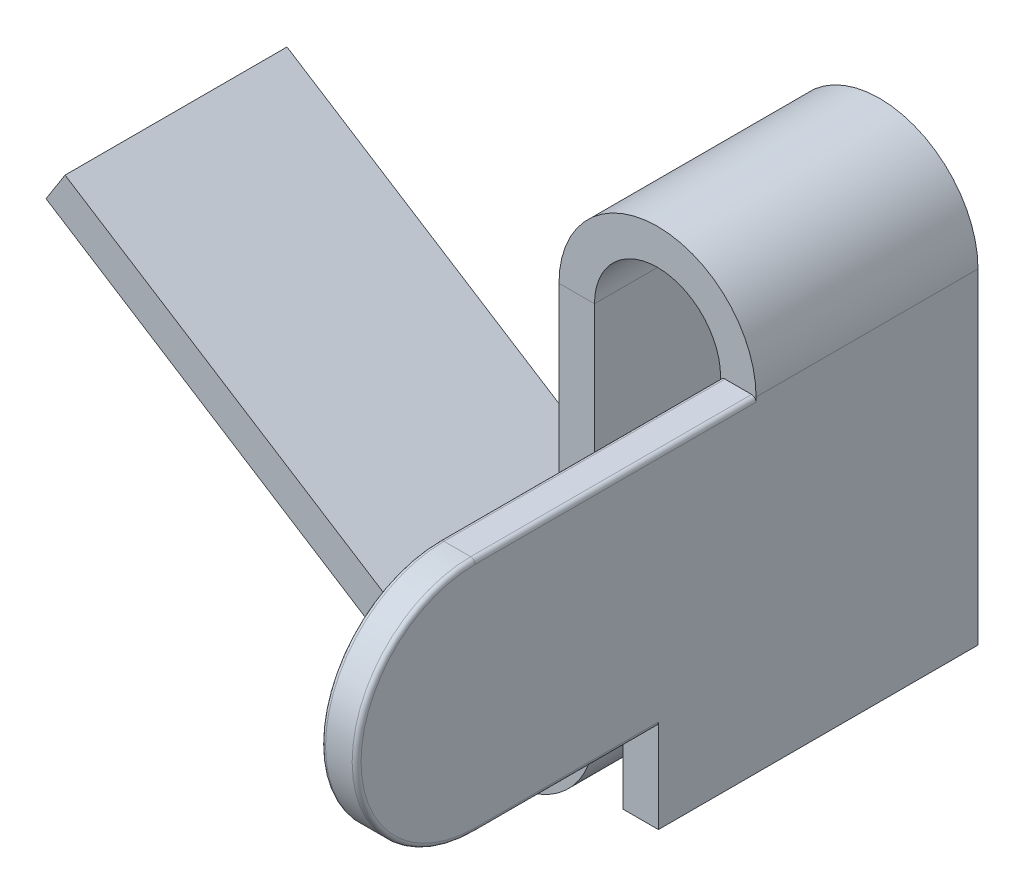
ISO-10303-21;
HEADER;
FILE_DESCRIPTION(('STEP AP214'),'2;1');
FILE_NAME('part.step','',(''),(''),'','','');
FILE_SCHEMA(('AUTOMOTIVE_DESIGN { 1 0 10303 214 1 1 1 1 }'));
ENDSEC;
DATA;
#1=APPLICATION_CONTEXT('core data for automotive mechanical design processes');
#2=APPLICATION_PROTOCOL_DEFINITION('international standard','automotive_design',2000,#1);
#3=PRODUCT_CONTEXT('',#1,'mechanical');
#4=PRODUCT('Part','Part','',(#3));
#5=PRODUCT_RELATED_PRODUCT_CATEGORY('part','',(#4));
#6=PRODUCT_DEFINITION_FORMATION('','',#4);
#7=PRODUCT_DEFINITION_CONTEXT('part definition',#1,'design');
#8=PRODUCT_DEFINITION('design','',#6,#7);
#9=PRODUCT_DEFINITION_SHAPE('','',#8);
#10=(LENGTH_UNIT() NAMED_UNIT(*) SI_UNIT(.MILLI.,.METRE.));
#11=(NAMED_UNIT(*) PLANE_ANGLE_UNIT() SI_UNIT($,.RADIAN.));
#12=(NAMED_UNIT(*) SI_UNIT($,.STERADIAN.) SOLID_ANGLE_UNIT());
#13=UNCERTAINTY_MEASURE_WITH_UNIT(LENGTH_MEASURE(1.E-05),#10,'distance_accuracy_value','');
#14=(GEOMETRIC_REPRESENTATION_CONTEXT(3) GLOBAL_UNCERTAINTY_ASSIGNED_CONTEXT((#13)) GLOBAL_UNIT_ASSIGNED_CONTEXT((#10,
#11,#12)) REPRESENTATION_CONTEXT('',''));
#15=CARTESIAN_POINT('',(0.,0.,0.));
#16=DIRECTION('',(0.,0.,1.));
#17=DIRECTION('',(1.,0.,0.));
#18=AXIS2_PLACEMENT_3D('',#15,#16,#17);
#19=CARTESIAN_POINT('',(0.315950000000002,0.2225,2.520925));
#20=DIRECTION('',(-1.,0.,0.));
#21=DIRECTION('',(0.,-1.,0.));
#22=AXIS2_PLACEMENT_3D('',#19,#20,#21);
#23=CYLINDRICAL_SURFACE('',#22,0.594075);
#24=DIRECTION('',(1.,0.,0.));
#25=VECTOR('',#24,1.);
#26=CARTESIAN_POINT('',(0.31595,-0.371575,2.520925));
#27=LINE('',#26,#25);
#28=CARTESIAN_POINT('',(0.4717,-0.371575,2.520925));
#29=VERTEX_POINT('',#28);
#30=CARTESIAN_POINT('',(0.3382,-0.371575,2.520925));
#31=VERTEX_POINT('',#30);
#32=EDGE_CURVE('E244',#29,#31,#27,.F.);
#33=ORIENTED_EDGE('',*,*,#32,.F.);
#34=CARTESIAN_POINT('',(0.4717,0.2225,2.520925));
#35=DIRECTION('',(-1.,0.,0.));
#36=DIRECTION('',(0.,0.,1.));
#37=AXIS2_PLACEMENT_3D('',#34,#35,#36);
#38=CIRCLE('',#37,0.594075);
#39=CARTESIAN_POINT('',(0.4717,0.816575,2.520925));
#40=VERTEX_POINT('',#39);
#41=EDGE_CURVE('E274',#29,#40,#38,.T.);
#42=ORIENTED_EDGE('',*,*,#41,.T.);
#43=DIRECTION('',(1.,0.,0.));
#44=VECTOR('',#43,1.);
#45=CARTESIAN_POINT('',(0.31595,0.816575,2.520925));
#46=LINE('',#45,#44);
#47=CARTESIAN_POINT('',(0.3382,0.816575,2.520925));
#48=VERTEX_POINT('',#47);
#49=EDGE_CURVE('E241',#48,#40,#46,.T.);
#50=ORIENTED_EDGE('',*,*,#49,.F.);
#51=CARTESIAN_POINT('',(0.3382,0.2225,2.520925));
#52=DIRECTION('',(-1.,0.,0.));
#53=DIRECTION('',(0.,0.,1.));
#54=AXIS2_PLACEMENT_3D('',#51,#52,#53);
#55=CIRCLE('',#54,0.594075);
#56=EDGE_CURVE('E272',#48,#31,#55,.F.);
#57=ORIENTED_EDGE('',*,*,#56,.T.);
#58=EDGE_LOOP('',(#33,#42,#50,#57));
#59=FACE_BOUND('',#58,.T.);
#60=ADVANCED_FACE('F38',(#59),#23,.T.);
#61=CARTESIAN_POINT('',(0.31595,-0.816575,1.1125));
#62=DIRECTION('',(-1.,0.,0.));
#63=DIRECTION('',(0.,0.,1.));
#64=AXIS2_PLACEMENT_3D('',#61,#62,#63);
#65=PLANE('',#64);
#66=DIRECTION('',(0.,0.,-1.));
#67=VECTOR('',#66,1.);
#68=CARTESIAN_POINT('',(0.31595,0.794325,1.1125));
#69=LINE('',#68,#67);
#70=CARTESIAN_POINT('',(0.31595,0.794325,2.520925));
#71=VERTEX_POINT('',#70);
#72=CARTESIAN_POINT('',(0.31595,0.794325,1.1125));
#73=VERTEX_POINT('',#72);
#74=EDGE_CURVE('E265',#71,#73,#69,.T.);
#75=ORIENTED_EDGE('',*,*,#74,.T.);
#76=DIRECTION('',(0.,1.,0.));
#77=VECTOR('',#76,1.);
#78=CARTESIAN_POINT('',(0.31595,-0.816575,1.1125));
#79=LINE('',#78,#77);
#80=CARTESIAN_POINT('',(0.31595,0.816575,1.1125));
#81=VERTEX_POINT('',#80);
#82=EDGE_CURVE('E270',#73,#81,#79,.T.);
#83=ORIENTED_EDGE('',*,*,#82,.T.);
#84=DIRECTION('',(0.,0.,-1.));
#85=VECTOR('',#84,1.);
#86=CARTESIAN_POINT('',(0.31595,0.816575,1.1125));
#87=LINE('',#86,#85);
#88=CARTESIAN_POINT('',(0.31595,0.816575,0.));
#89=VERTEX_POINT('',#88);
#90=EDGE_CURVE('E202',#81,#89,#87,.T.);
#91=ORIENTED_EDGE('',*,*,#90,.T.);
#92=DIRECTION('',(0.,1.,0.));
#93=VECTOR('',#92,1.);
#94=CARTESIAN_POINT('',(0.31595,-0.816575,0.));
#95=LINE('',#94,#93);
#96=CARTESIAN_POINT('',(0.31595,-0.816575,0.));
#97=VERTEX_POINT('',#96);
#98=EDGE_CURVE('E358',#97,#89,#95,.T.);
#99=ORIENTED_EDGE('',*,*,#98,.F.);
#100=DIRECTION('',(0.,0.,-1.));
#101=VECTOR('',#100,1.);
#102=CARTESIAN_POINT('',(0.31595,-0.816575,1.1125));
#103=LINE('',#102,#101);
#104=CARTESIAN_POINT('',(0.31595,-0.816575,1.602));
#105=VERTEX_POINT('',#104);
#106=EDGE_CURVE('E199',#105,#97,#103,.T.);
#107=ORIENTED_EDGE('',*,*,#106,.F.);
#108=DIRECTION('',(0.,-1.,0.));
#109=VECTOR('',#108,1.);
#110=CARTESIAN_POINT('',(0.31595,-0.816575,1.602));
#111=LINE('',#110,#109);
#112=CARTESIAN_POINT('',(0.31595,-0.349325,1.602));
#113=VERTEX_POINT('',#112);
#114=EDGE_CURVE('E63',#113,#105,#111,.T.);
#115=ORIENTED_EDGE('',*,*,#114,.F.);
#116=DIRECTION('',(0.,0.,1.));
#117=VECTOR('',#116,1.);
#118=CARTESIAN_POINT('',(0.31595,-0.349325,1.1125));
#119=LINE('',#118,#117);
#120=CARTESIAN_POINT('',(0.31595,-0.349325,2.520925));
#121=VERTEX_POINT('',#120);
#122=EDGE_CURVE('E268',#113,#121,#119,.T.);
#123=ORIENTED_EDGE('',*,*,#122,.T.);
#124=CARTESIAN_POINT('',(0.31595,0.2225,2.520925));
#125=DIRECTION('',(-1.,0.,0.));
#126=DIRECTION('',(0.,0.,1.));
#127=AXIS2_PLACEMENT_3D('',#124,#125,#126);
#128=CIRCLE('',#127,0.571825);
#129=EDGE_CURVE('E263',#121,#71,#128,.T.);
#130=ORIENTED_EDGE('',*,*,#129,.T.);
#131=EDGE_LOOP('',(#75,#83,#91,#99,#107,#115,#123,#130));
#132=FACE_BOUND('',#131,.T.);
#133=ADVANCED_FACE('F302',(#132),#65,.T.);
#134=CARTESIAN_POINT('',(0.49395,-0.816575,1.1125));
#135=DIRECTION('',(0.,-1.,0.));
#136=DIRECTION('',(0.,0.,-1.));
#137=AXIS2_PLACEMENT_3D('',#134,#135,#136);
#138=PLANE('',#137);
#139=DIRECTION('',(0.,0.,-1.));
#140=VECTOR('',#139,1.);
#141=CARTESIAN_POINT('',(0.49395,-0.816575,1.1125));
#142=LINE('',#141,#140);
#143=CARTESIAN_POINT('',(0.49395,-0.816575,1.602));
#144=VERTEX_POINT('',#143);
#145=CARTESIAN_POINT('',(0.49395,-0.816575,0.));
#146=VERTEX_POINT('',#145);
#147=EDGE_CURVE('E189',#144,#146,#142,.T.);
#148=ORIENTED_EDGE('',*,*,#147,.F.);
#149=DIRECTION('',(-1.,0.,0.));
#150=VECTOR('',#149,1.);
#151=CARTESIAN_POINT('',(0.31595,-0.816575,1.602));
#152=LINE('',#151,#150);
#153=EDGE_CURVE('E176',#105,#144,#152,.F.);
#154=ORIENTED_EDGE('',*,*,#153,.F.);
#155=ORIENTED_EDGE('',*,*,#106,.T.);
#156=DIRECTION('',(-1.,0.,0.));
#157=VECTOR('',#156,1.);
#158=CARTESIAN_POINT('',(0.49395,-0.816575,0.));
#159=LINE('',#158,#157);
#160=EDGE_CURVE('E198',#146,#97,#159,.T.);
#161=ORIENTED_EDGE('',*,*,#160,.F.);
#162=EDGE_LOOP('',(#148,#154,#155,#161));
#163=FACE_BOUND('',#162,.T.);
#164=ADVANCED_FACE('F196',(#163),#138,.T.);
#165=CARTESIAN_POINT('',(0.49395,-0.816575,1.1125));
#166=DIRECTION('',(-1.,0.,0.));
#167=DIRECTION('',(0.,0.,1.));
#168=AXIS2_PLACEMENT_3D('',#165,#166,#167);
#169=PLANE('',#168);
#170=DIRECTION('',(0.,0.,1.));
#171=VECTOR('',#170,1.);
#172=CARTESIAN_POINT('',(0.49395,-0.349325,1.602));
#173=LINE('',#172,#171);
#174=CARTESIAN_POINT('',(0.49395,-0.349324999999999,2.520925));
#175=VERTEX_POINT('',#174);
#176=CARTESIAN_POINT('',(0.49395,-0.349325,1.602));
#177=VERTEX_POINT('',#176);
#178=EDGE_CURVE('E192',#175,#177,#173,.F.);
#179=ORIENTED_EDGE('',*,*,#178,.T.);
#180=DIRECTION('',(0.,1.,0.));
#181=VECTOR('',#180,1.);
#182=CARTESIAN_POINT('',(0.49395,-0.816575,1.602));
#183=LINE('',#182,#181);
#184=EDGE_CURVE('E180',#177,#144,#183,.F.);
#185=ORIENTED_EDGE('',*,*,#184,.T.);
#186=ORIENTED_EDGE('',*,*,#147,.T.);
#187=DIRECTION('',(0.,1.,0.));
#188=VECTOR('',#187,1.);
#189=CARTESIAN_POINT('',(0.49395,-0.816575,0.));
#190=LINE('',#189,#188);
#191=CARTESIAN_POINT('',(0.49395,0.816575,0.));
#192=VERTEX_POINT('',#191);
#193=EDGE_CURVE('E362',#146,#192,#190,.T.);
#194=ORIENTED_EDGE('',*,*,#193,.T.);
#195=DIRECTION('',(0.,0.,-1.));
#196=VECTOR('',#195,1.);
#197=CARTESIAN_POINT('',(0.49395,0.816575,1.1125));
#198=LINE('',#197,#196);
#199=CARTESIAN_POINT('',(0.49395,0.816575,1.1125));
#200=VERTEX_POINT('',#199);
#201=EDGE_CURVE('E200',#200,#192,#198,.T.);
#202=ORIENTED_EDGE('',*,*,#201,.F.);
#203=DIRECTION('',(0.,-1.,0.));
#204=VECTOR('',#203,1.);
#205=CARTESIAN_POINT('',(0.49395,0.816574999999998,1.1125));
#206=LINE('',#205,#204);
#207=CARTESIAN_POINT('',(0.49395,0.794325000000001,1.1125));
#208=VERTEX_POINT('',#207);
#209=EDGE_CURVE('E55',#200,#208,#206,.T.);
#210=ORIENTED_EDGE('',*,*,#209,.T.);
#211=DIRECTION('',(0.,0.,-1.));
#212=VECTOR('',#211,1.);
#213=CARTESIAN_POINT('',(0.49395,0.794325000000001,1.1125));
#214=LINE('',#213,#212);
#215=CARTESIAN_POINT('',(0.49395,0.794325000000001,2.520925));
#216=VERTEX_POINT('',#215);
#217=EDGE_CURVE('E255',#208,#216,#214,.F.);
#218=ORIENTED_EDGE('',*,*,#217,.T.);
#219=CARTESIAN_POINT('',(0.49395,0.2225,2.520925));
#220=DIRECTION('',(-1.,0.,0.));
#221=DIRECTION('',(0.,0.,1.));
#222=AXIS2_PLACEMENT_3D('',#219,#220,#221);
#223=CIRCLE('',#222,0.571825);
#224=EDGE_CURVE('E252',#216,#175,#223,.F.);
#225=ORIENTED_EDGE('',*,*,#224,.T.);
#226=EDGE_LOOP('',(#179,#185,#186,#194,#202,#210,#218,#225));
#227=FACE_BOUND('',#226,.T.);
#228=ADVANCED_FACE('F187',(#227),#169,.F.);
#229=CARTESIAN_POINT('',(-0.31595,0.816574999999998,1.1125));
#230=DIRECTION('',(0.,0.,1.));
#231=DIRECTION('',(1.,0.,0.));
#232=AXIS2_PLACEMENT_3D('',#229,#230,#231);
#233=PLANE('',#232);
#234=DIRECTION('',(-1.,0.,0.));
#235=VECTOR('',#234,1.);
#236=CARTESIAN_POINT('',(-0.31595,0.816574999999998,1.1125));
#237=LINE('',#236,#235);
#238=CARTESIAN_POINT('',(-0.31595,0.816574999999998,1.1125));
#239=VERTEX_POINT('',#238);
#240=CARTESIAN_POINT('',(-0.49395,0.816574999999998,1.1125));
#241=VERTEX_POINT('',#240);
#242=EDGE_CURVE('E239',#239,#241,#237,.T.);
#243=ORIENTED_EDGE('',*,*,#242,.F.);
#244=CARTESIAN_POINT('',(0.,0.816574999999999,1.1125));
#245=DIRECTION('',(0.,0.,1.));
#246=DIRECTION('',(1.,0.,0.));
#247=AXIS2_PLACEMENT_3D('',#244,#245,#246);
#248=CIRCLE('',#247,0.31595);
#249=EDGE_CURVE('E332',#81,#239,#248,.T.);
#250=ORIENTED_EDGE('',*,*,#249,.F.);
#251=ORIENTED_EDGE('',*,*,#82,.F.);
#252=CARTESIAN_POINT('',(0.3382,0.794325,1.1125));
#253=DIRECTION('',(0.,0.,1.));
#254=DIRECTION('',(1.,0.,0.));
#255=AXIS2_PLACEMENT_3D('',#252,#253,#254);
#256=CIRCLE('',#255,0.02225);
#257=CARTESIAN_POINT('',(0.3382,0.816575,1.1125));
#258=VERTEX_POINT('',#257);
#259=EDGE_CURVE('E11',#73,#258,#256,.F.);
#260=ORIENTED_EDGE('',*,*,#259,.T.);
#261=DIRECTION('',(-1.,0.,0.));
#262=VECTOR('',#261,1.);
#263=CARTESIAN_POINT('',(0.49395,0.816575,1.1125));
#264=LINE('',#263,#262);
#265=CARTESIAN_POINT('',(0.4717,0.816575,1.1125));
#266=VERTEX_POINT('',#265);
#267=EDGE_CURVE('E236',#266,#258,#264,.T.);
#268=ORIENTED_EDGE('',*,*,#267,.F.);
#269=CARTESIAN_POINT('',(0.4717,0.794325000000001,1.1125));
#270=DIRECTION('',(0.,0.,1.));
#271=DIRECTION('',(1.,0.,0.));
#272=AXIS2_PLACEMENT_3D('',#269,#270,#271);
#273=CIRCLE('',#272,0.02225);
#274=EDGE_CURVE('E276',#266,#208,#273,.F.);
#275=ORIENTED_EDGE('',*,*,#274,.T.);
#276=ORIENTED_EDGE('',*,*,#209,.F.);
#277=CARTESIAN_POINT('',(0.,0.816574999999999,1.1125));
#278=DIRECTION('',(0.,0.,1.));
#279=DIRECTION('',(1.,0.,0.));
#280=AXIS2_PLACEMENT_3D('',#277,#278,#279);
#281=CIRCLE('',#280,0.49395);
#282=EDGE_CURVE('E335',#200,#241,#281,.T.);
#283=ORIENTED_EDGE('',*,*,#282,.T.);
#284=EDGE_LOOP('',(#243,#250,#251,#260,#268,#275,#276,#283));
#285=FACE_BOUND('',#284,.T.);
#286=ADVANCED_FACE('F425',(#285),#233,.T.);
#287=CARTESIAN_POINT('',(0.49395,0.816575,1.1125));
#288=DIRECTION('',(0.,0.,1.));
#289=DIRECTION('',(1.,0.,0.));
#290=AXIS2_PLACEMENT_3D('',#287,#288,#289);
#291=PLANE('',#290);
#292=DIRECTION('',(0.,-1.,0.));
#293=VECTOR('',#292,1.);
#294=CARTESIAN_POINT('',(-0.31595,0.816574999999998,1.1125));
#295=LINE('',#294,#293);
#296=CARTESIAN_POINT('',(-0.31595,-1.039075,1.1125));
#297=VERTEX_POINT('',#296);
#298=EDGE_CURVE('E329',#239,#297,#295,.T.);
#299=ORIENTED_EDGE('',*,*,#298,.F.);
#300=ORIENTED_EDGE('',*,*,#242,.T.);
#301=DIRECTION('',(0.,1.,0.));
#302=VECTOR('',#301,1.);
#303=CARTESIAN_POINT('',(-0.49395,0.816574999999998,1.1125));
#304=LINE('',#303,#302);
#305=CARTESIAN_POINT('',(-0.49395,-1.039075,1.1125));
#306=VERTEX_POINT('',#305);
#307=EDGE_CURVE('E337',#241,#306,#304,.F.);
#308=ORIENTED_EDGE('',*,*,#307,.T.);
#309=DIRECTION('',(1.,0.,0.));
#310=VECTOR('',#309,1.);
#311=CARTESIAN_POINT('',(-0.49395,-1.039075,1.1125));
#312=LINE('',#311,#310);
#313=EDGE_CURVE('E228',#306,#297,#312,.T.);
#314=ORIENTED_EDGE('',*,*,#313,.T.);
#315=EDGE_LOOP('',(#299,#300,#308,#314));
#316=FACE_BOUND('',#315,.T.);
#317=ADVANCED_FACE('F423',(#316),#291,.T.);
#318=CARTESIAN_POINT('',(0.31595,0.816575,0.));
#319=DIRECTION('',(0.,0.,-1.));
#320=DIRECTION('',(-1.,0.,0.));
#321=AXIS2_PLACEMENT_3D('',#318,#319,#320);
#322=PLANE('',#321);
#323=DIRECTION('',(1.,0.,0.));
#324=VECTOR('',#323,1.);
#325=CARTESIAN_POINT('',(0.31595,0.816575,0.));
#326=LINE('',#325,#324);
#327=EDGE_CURVE('E234',#89,#192,#326,.T.);
#328=ORIENTED_EDGE('',*,*,#327,.F.);
#329=CARTESIAN_POINT('',(0.,0.816574999999999,0.));
#330=DIRECTION('',(0.,0.,1.));
#331=DIRECTION('',(1.,0.,0.));
#332=AXIS2_PLACEMENT_3D('',#329,#330,#331);
#333=CIRCLE('',#332,0.31595);
#334=CARTESIAN_POINT('',(-0.31595,0.816574999999998,0.));
#335=VERTEX_POINT('',#334);
#336=EDGE_CURVE('E355',#89,#335,#333,.T.);
#337=ORIENTED_EDGE('',*,*,#336,.T.);
#338=DIRECTION('',(1.,0.,0.));
#339=VECTOR('',#338,1.);
#340=CARTESIAN_POINT('',(-0.49395,0.816574999999998,0.));
#341=LINE('',#340,#339);
#342=CARTESIAN_POINT('',(-0.49395,0.816574999999998,0.));
#343=VERTEX_POINT('',#342);
#344=EDGE_CURVE('E232',#343,#335,#341,.T.);
#345=ORIENTED_EDGE('',*,*,#344,.F.);
#346=CARTESIAN_POINT('',(0.,0.816574999999999,0.));
#347=DIRECTION('',(0.,0.,1.));
#348=DIRECTION('',(1.,0.,0.));
#349=AXIS2_PLACEMENT_3D('',#346,#347,#348);
#350=CIRCLE('',#349,0.49395);
#351=EDGE_CURVE('E364',#192,#343,#350,.T.);
#352=ORIENTED_EDGE('',*,*,#351,.F.);
#353=EDGE_LOOP('',(#328,#337,#345,#352));
#354=FACE_BOUND('',#353,.T.);
#355=ADVANCED_FACE('F429',(#354),#322,.T.);
#356=CARTESIAN_POINT('',(-0.49395,0.816574999999998,0.));
#357=DIRECTION('',(0.,0.,-1.));
#358=DIRECTION('',(-1.,0.,0.));
#359=AXIS2_PLACEMENT_3D('',#356,#357,#358);
#360=PLANE('',#359);
#361=ORIENTED_EDGE('',*,*,#98,.T.);
#362=ORIENTED_EDGE('',*,*,#327,.T.);
#363=ORIENTED_EDGE('',*,*,#193,.F.);
#364=ORIENTED_EDGE('',*,*,#160,.T.);
#365=EDGE_LOOP('',(#361,#362,#363,#364));
#366=FACE_BOUND('',#365,.T.);
#367=ADVANCED_FACE('F435',(#366),#360,.T.);
#368=CARTESIAN_POINT('',(-0.999589620706684,-1.41467602692747,1.1125));
#369=DIRECTION('',(0.,0.,1.));
#370=DIRECTION('',(1.,0.,0.));
#371=AXIS2_PLACEMENT_3D('',#368,#369,#370);
#372=PLANE('',#371);
#373=DIRECTION('',(0.536268810576818,0.844047251522404,0.));
#374=VECTOR('',#373,1.);
#375=CARTESIAN_POINT('',(-0.999589620706684,-1.41467602692747,1.1125));
#376=LINE('',#375,#374);
#377=CARTESIAN_POINT('',(-0.999589620706684,-1.41467602692747,1.1125));
#378=VERTEX_POINT('',#377);
#379=CARTESIAN_POINT('',(-0.904133772424011,-1.26443561615648,1.1125));
#380=VERTEX_POINT('',#379);
#381=EDGE_CURVE('E230',#378,#380,#376,.T.);
#382=ORIENTED_EDGE('',*,*,#381,.F.);
#383=CARTESIAN_POINT('',(-0.76095,-1.039075,1.1125));
#384=DIRECTION('',(0.,0.,-1.));
#385=DIRECTION('',(-1.,0.,0.));
#386=AXIS2_PLACEMENT_3D('',#383,#384,#385);
#387=CIRCLE('',#386,0.445);
#388=EDGE_CURVE('E326',#297,#378,#387,.T.);
#389=ORIENTED_EDGE('',*,*,#388,.F.);
#390=ORIENTED_EDGE('',*,*,#313,.F.);
#391=CARTESIAN_POINT('',(-0.76095,-1.039075,1.1125));
#392=DIRECTION('',(0.,0.,1.));
#393=DIRECTION('',(1.,0.,0.));
#394=AXIS2_PLACEMENT_3D('',#391,#392,#393);
#395=CIRCLE('',#394,0.267);
#396=EDGE_CURVE('E340',#306,#380,#395,.F.);
#397=ORIENTED_EDGE('',*,*,#396,.T.);
#398=EDGE_LOOP('',(#382,#389,#390,#397));
#399=FACE_BOUND('',#398,.T.);
#400=ADVANCED_FACE('F421',(#399),#372,.T.);
#401=CARTESIAN_POINT('',(-0.49395,-1.039075,1.1125));
#402=DIRECTION('',(0.,0.,1.));
#403=DIRECTION('',(1.,0.,0.));
#404=AXIS2_PLACEMENT_3D('',#401,#402,#403);
#405=PLANE('',#404);
#406=DIRECTION('',(-0.844047251522404,0.536268810576819,0.));
#407=VECTOR('',#406,1.);
#408=CARTESIAN_POINT('',(-0.999589620706684,-1.41467602692747,1.1125));
#409=LINE('',#408,#407);
#410=CARTESIAN_POINT('',(-3.06539526880777,-0.102158113040705,1.1125));
#411=VERTEX_POINT('',#410);
#412=EDGE_CURVE('E323',#378,#411,#409,.T.);
#413=ORIENTED_EDGE('',*,*,#412,.F.);
#414=ORIENTED_EDGE('',*,*,#381,.T.);
#415=DIRECTION('',(-0.844047251522404,0.536268810576819,0.));
#416=VECTOR('',#415,1.);
#417=CARTESIAN_POINT('',(-0.904133772424011,-1.26443561615648,1.1125));
#418=LINE('',#417,#416);
#419=CARTESIAN_POINT('',(-2.96993942052509,0.0480822977302832,1.1125));
#420=VERTEX_POINT('',#419);
#421=EDGE_CURVE('E317',#380,#420,#418,.T.);
#422=ORIENTED_EDGE('',*,*,#421,.T.);
#423=DIRECTION('',(0.536268810576814,0.844047251522407,0.));
#424=VECTOR('',#423,1.);
#425=CARTESIAN_POINT('',(-3.06539526880777,-0.102158113040705,1.1125));
#426=LINE('',#425,#424);
#427=EDGE_CURVE('E319',#411,#420,#426,.T.);
#428=ORIENTED_EDGE('',*,*,#427,.F.);
#429=EDGE_LOOP('',(#413,#414,#422,#428));
#430=FACE_BOUND('',#429,.T.);
#431=ADVANCED_FACE('F419',(#430),#405,.T.);
#432=CARTESIAN_POINT('',(-0.31595,-1.039075,0.));
#433=DIRECTION('',(0.,0.,-1.));
#434=DIRECTION('',(-1.,0.,0.));
#435=AXIS2_PLACEMENT_3D('',#432,#433,#434);
#436=PLANE('',#435);
#437=DIRECTION('',(-1.,0.,0.));
#438=VECTOR('',#437,1.);
#439=CARTESIAN_POINT('',(-0.31595,-1.039075,0.));
#440=LINE('',#439,#438);
#441=CARTESIAN_POINT('',(-0.31595,-1.039075,0.));
#442=VERTEX_POINT('',#441);
#443=CARTESIAN_POINT('',(-0.49395,-1.039075,0.));
#444=VERTEX_POINT('',#443);
#445=EDGE_CURVE('E226',#442,#444,#440,.T.);
#446=ORIENTED_EDGE('',*,*,#445,.F.);
#447=CARTESIAN_POINT('',(-0.76095,-1.039075,0.));
#448=DIRECTION('',(0.,0.,-1.));
#449=DIRECTION('',(-1.,0.,0.));
#450=AXIS2_PLACEMENT_3D('',#447,#448,#449);
#451=CIRCLE('',#450,0.445);
#452=CARTESIAN_POINT('',(-0.999589620706684,-1.41467602692747,0.));
#453=VERTEX_POINT('',#452);
#454=EDGE_CURVE('E349',#442,#453,#451,.T.);
#455=ORIENTED_EDGE('',*,*,#454,.T.);
#456=DIRECTION('',(-0.536268810576818,-0.844047251522404,0.));
#457=VECTOR('',#456,1.);
#458=CARTESIAN_POINT('',(-0.904133772424011,-1.26443561615648,0.));
#459=LINE('',#458,#457);
#460=CARTESIAN_POINT('',(-0.904133772424011,-1.26443561615648,0.));
#461=VERTEX_POINT('',#460);
#462=EDGE_CURVE('E224',#461,#453,#459,.T.);
#463=ORIENTED_EDGE('',*,*,#462,.F.);
#464=CARTESIAN_POINT('',(-0.76095,-1.039075,0.));
#465=DIRECTION('',(0.,0.,1.));
#466=DIRECTION('',(1.,0.,0.));
#467=AXIS2_PLACEMENT_3D('',#464,#465,#466);
#468=CIRCLE('',#467,0.267);
#469=EDGE_CURVE('E320',#444,#461,#468,.F.);
#470=ORIENTED_EDGE('',*,*,#469,.F.);
#471=EDGE_LOOP('',(#446,#455,#463,#470));
#472=FACE_BOUND('',#471,.T.);
#473=ADVANCED_FACE('F390',(#472),#436,.T.);
#474=CARTESIAN_POINT('',(-0.904133772424011,-1.26443561615648,0.));
#475=DIRECTION('',(0.,0.,-1.));
#476=DIRECTION('',(-1.,0.,0.));
#477=AXIS2_PLACEMENT_3D('',#474,#475,#476);
#478=PLANE('',#477);
#479=DIRECTION('',(0.,-1.,0.));
#480=VECTOR('',#479,1.);
#481=CARTESIAN_POINT('',(-0.31595,0.816574999999998,0.));
#482=LINE('',#481,#480);
#483=EDGE_CURVE('E352',#335,#442,#482,.T.);
#484=ORIENTED_EDGE('',*,*,#483,.T.);
#485=ORIENTED_EDGE('',*,*,#445,.T.);
#486=DIRECTION('',(0.,1.,0.));
#487=VECTOR('',#486,1.);
#488=CARTESIAN_POINT('',(-0.49395,0.816574999999998,0.));
#489=LINE('',#488,#487);
#490=EDGE_CURVE('E367',#343,#444,#489,.F.);
#491=ORIENTED_EDGE('',*,*,#490,.F.);
#492=ORIENTED_EDGE('',*,*,#344,.T.);
#493=EDGE_LOOP('',(#484,#485,#491,#492));
#494=FACE_BOUND('',#493,.T.);
#495=ADVANCED_FACE('F386',(#494),#478,.T.);
#496=CARTESIAN_POINT('',(-0.904133772424011,-1.26443561615648,1.1125));
#497=DIRECTION('',(-0.536268810576819,-0.844047251522404,0.));
#498=DIRECTION('',(0.844047251522404,-0.536268810576819,0.));
#499=AXIS2_PLACEMENT_3D('',#496,#497,#498);
#500=PLANE('',#499);
#501=DIRECTION('',(-0.844047251522404,0.536268810576819,0.));
#502=VECTOR('',#501,1.);
#503=CARTESIAN_POINT('',(-0.904133772424011,-1.26443561615648,0.));
#504=LINE('',#503,#502);
#505=CARTESIAN_POINT('',(-2.96993942052509,0.0480822977302832,0.));
#506=VERTEX_POINT('',#505);
#507=EDGE_CURVE('E310',#461,#506,#504,.T.);
#508=ORIENTED_EDGE('',*,*,#507,.T.);
#509=DIRECTION('',(0.,0.,-1.));
#510=VECTOR('',#509,1.);
#511=CARTESIAN_POINT('',(-2.96993942052509,0.0480822977302832,1.1125));
#512=LINE('',#511,#510);
#513=EDGE_CURVE('E222',#420,#506,#512,.T.);
#514=ORIENTED_EDGE('',*,*,#513,.F.);
#515=ORIENTED_EDGE('',*,*,#421,.F.);
#516=DIRECTION('',(0.,0.,-1.));
#517=VECTOR('',#516,1.);
#518=CARTESIAN_POINT('',(-0.904133772424011,-1.26443561615648,1.1125));
#519=LINE('',#518,#517);
#520=EDGE_CURVE('E342',#380,#461,#519,.T.);
#521=ORIENTED_EDGE('',*,*,#520,.T.);
#522=EDGE_LOOP('',(#508,#514,#515,#521));
#523=FACE_BOUND('',#522,.T.);
#524=ADVANCED_FACE('F415',(#523),#500,.F.);
#525=CARTESIAN_POINT('',(-3.06539526880777,-0.102158113040705,1.1125));
#526=DIRECTION('',(-0.844047251522407,0.536268810576814,0.));
#527=DIRECTION('',(-0.536268810576815,-0.844047251522407,0.));
#528=AXIS2_PLACEMENT_3D('',#525,#526,#527);
#529=PLANE('',#528);
#530=DIRECTION('',(0.536268810576814,0.844047251522407,0.));
#531=VECTOR('',#530,1.);
#532=CARTESIAN_POINT('',(-3.06539526880777,-0.102158113040705,0.));
#533=LINE('',#532,#531);
#534=CARTESIAN_POINT('',(-3.06539526880777,-0.102158113040705,0.));
#535=VERTEX_POINT('',#534);
#536=EDGE_CURVE('E313',#535,#506,#533,.T.);
#537=ORIENTED_EDGE('',*,*,#536,.F.);
#538=DIRECTION('',(0.,0.,-1.));
#539=VECTOR('',#538,1.);
#540=CARTESIAN_POINT('',(-3.06539526880777,-0.102158113040705,1.1125));
#541=LINE('',#540,#539);
#542=EDGE_CURVE('E220',#411,#535,#541,.T.);
#543=ORIENTED_EDGE('',*,*,#542,.F.);
#544=ORIENTED_EDGE('',*,*,#427,.T.);
#545=ORIENTED_EDGE('',*,*,#513,.T.);
#546=EDGE_LOOP('',(#537,#543,#544,#545));
#547=FACE_BOUND('',#546,.T.);
#548=ADVANCED_FACE('F556',(#547),#529,.T.);
#549=CARTESIAN_POINT('',(-0.999589620706684,-1.41467602692747,1.1125));
#550=DIRECTION('',(-0.536268810576819,-0.844047251522404,0.));
#551=DIRECTION('',(0.844047251522404,-0.536268810576819,0.));
#552=AXIS2_PLACEMENT_3D('',#549,#550,#551);
#553=PLANE('',#552);
#554=DIRECTION('',(-0.844047251522404,0.536268810576819,0.));
#555=VECTOR('',#554,1.);
#556=CARTESIAN_POINT('',(-0.999589620706684,-1.41467602692747,0.));
#557=LINE('',#556,#555);
#558=EDGE_CURVE('E346',#453,#535,#557,.T.);
#559=ORIENTED_EDGE('',*,*,#558,.F.);
#560=DIRECTION('',(0.,0.,-1.));
#561=VECTOR('',#560,1.);
#562=CARTESIAN_POINT('',(-0.999589620706684,-1.41467602692747,1.1125));
#563=LINE('',#562,#561);
#564=EDGE_CURVE('E217',#378,#453,#563,.T.);
#565=ORIENTED_EDGE('',*,*,#564,.F.);
#566=ORIENTED_EDGE('',*,*,#412,.T.);
#567=ORIENTED_EDGE('',*,*,#542,.T.);
#568=EDGE_LOOP('',(#559,#565,#566,#567));
#569=FACE_BOUND('',#568,.T.);
#570=ADVANCED_FACE('F404',(#569),#553,.T.);
#571=CARTESIAN_POINT('',(-0.76095,-1.039075,1.1125));
#572=DIRECTION('',(0.,0.,-1.));
#573=DIRECTION('',(-1.,0.,0.));
#574=AXIS2_PLACEMENT_3D('',#571,#572,#573);
#575=CYLINDRICAL_SURFACE('',#574,0.445);
#576=ORIENTED_EDGE('',*,*,#454,.F.);
#577=DIRECTION('',(0.,0.,-1.));
#578=VECTOR('',#577,1.);
#579=CARTESIAN_POINT('',(-0.31595,-1.039075,1.1125));
#580=LINE('',#579,#578);
#581=EDGE_CURVE('E214',#297,#442,#580,.T.);
#582=ORIENTED_EDGE('',*,*,#581,.F.);
#583=ORIENTED_EDGE('',*,*,#388,.T.);
#584=ORIENTED_EDGE('',*,*,#564,.T.);
#585=EDGE_LOOP('',(#576,#582,#583,#584));
#586=FACE_BOUND('',#585,.T.);
#587=ADVANCED_FACE('F399',(#586),#575,.T.);
#588=CARTESIAN_POINT('',(-0.31595,0.816574999999998,1.1125));
#589=DIRECTION('',(1.,0.,0.));
#590=DIRECTION('',(0.,0.,-1.));
#591=AXIS2_PLACEMENT_3D('',#588,#589,#590);
#592=PLANE('',#591);
#593=ORIENTED_EDGE('',*,*,#483,.F.);
#594=DIRECTION('',(0.,0.,-1.));
#595=VECTOR('',#594,1.);
#596=CARTESIAN_POINT('',(-0.31595,0.816574999999998,1.1125));
#597=LINE('',#596,#595);
#598=EDGE_CURVE('E211',#239,#335,#597,.T.);
#599=ORIENTED_EDGE('',*,*,#598,.F.);
#600=ORIENTED_EDGE('',*,*,#298,.T.);
#601=ORIENTED_EDGE('',*,*,#581,.T.);
#602=EDGE_LOOP('',(#593,#599,#600,#601));
#603=FACE_BOUND('',#602,.T.);
#604=ADVANCED_FACE('F394',(#603),#592,.T.);
#605=CARTESIAN_POINT('',(0.,0.816574999999999,1.1125));
#606=DIRECTION('',(0.,0.,-1.));
#607=DIRECTION('',(-1.,0.,0.));
#608=AXIS2_PLACEMENT_3D('',#605,#606,#607);
#609=CYLINDRICAL_SURFACE('',#608,0.31595);
#610=ORIENTED_EDGE('',*,*,#336,.F.);
#611=ORIENTED_EDGE('',*,*,#90,.F.);
#612=ORIENTED_EDGE('',*,*,#249,.T.);
#613=ORIENTED_EDGE('',*,*,#598,.T.);
#614=EDGE_LOOP('',(#610,#611,#612,#613));
#615=FACE_BOUND('',#614,.T.);
#616=ADVANCED_FACE('F432',(#615),#609,.F.);
#617=CARTESIAN_POINT('',(0.,0.816574999999999,1.1125));
#618=DIRECTION('',(0.,0.,-1.));
#619=DIRECTION('',(-1.,0.,0.));
#620=AXIS2_PLACEMENT_3D('',#617,#618,#619);
#621=CYLINDRICAL_SURFACE('',#620,0.49395);
#622=ORIENTED_EDGE('',*,*,#351,.T.);
#623=DIRECTION('',(0.,0.,-1.));
#624=VECTOR('',#623,1.);
#625=CARTESIAN_POINT('',(-0.49395,0.816574999999998,1.1125));
#626=LINE('',#625,#624);
#627=EDGE_CURVE('E205',#241,#343,#626,.T.);
#628=ORIENTED_EDGE('',*,*,#627,.F.);
#629=ORIENTED_EDGE('',*,*,#282,.F.);
#630=ORIENTED_EDGE('',*,*,#201,.T.);
#631=EDGE_LOOP('',(#622,#628,#629,#630));
#632=FACE_BOUND('',#631,.T.);
#633=ADVANCED_FACE('F426',(#632),#621,.T.);
#634=CARTESIAN_POINT('',(-0.49395,0.816574999999998,1.1125));
#635=DIRECTION('',(1.,0.,0.));
#636=DIRECTION('',(0.,0.,-1.));
#637=AXIS2_PLACEMENT_3D('',#634,#635,#636);
#638=PLANE('',#637);
#639=ORIENTED_EDGE('',*,*,#490,.T.);
#640=DIRECTION('',(0.,0.,-1.));
#641=VECTOR('',#640,1.);
#642=CARTESIAN_POINT('',(-0.49395,-1.039075,1.1125));
#643=LINE('',#642,#641);
#644=EDGE_CURVE('E374',#306,#444,#643,.T.);
#645=ORIENTED_EDGE('',*,*,#644,.F.);
#646=ORIENTED_EDGE('',*,*,#307,.F.);
#647=ORIENTED_EDGE('',*,*,#627,.T.);
#648=EDGE_LOOP('',(#639,#645,#646,#647));
#649=FACE_BOUND('',#648,.T.);
#650=ADVANCED_FACE('F381',(#649),#638,.F.);
#651=CARTESIAN_POINT('',(-0.76095,-1.039075,1.1125));
#652=DIRECTION('',(0.,0.,-1.));
#653=DIRECTION('',(-1.,0.,0.));
#654=AXIS2_PLACEMENT_3D('',#651,#652,#653);
#655=CYLINDRICAL_SURFACE('',#654,0.267);
#656=ORIENTED_EDGE('',*,*,#469,.T.);
#657=ORIENTED_EDGE('',*,*,#520,.F.);
#658=ORIENTED_EDGE('',*,*,#396,.F.);
#659=ORIENTED_EDGE('',*,*,#644,.T.);
#660=EDGE_LOOP('',(#656,#657,#658,#659));
#661=FACE_BOUND('',#660,.T.);
#662=ADVANCED_FACE('F411',(#661),#655,.F.);
#663=CARTESIAN_POINT('',(-0.76095,-1.039075,0.));
#664=DIRECTION('',(0.,0.,-1.));
#665=DIRECTION('',(-1.,0.,0.));
#666=AXIS2_PLACEMENT_3D('',#663,#664,#665);
#667=PLANE('',#666);
#668=ORIENTED_EDGE('',*,*,#507,.F.);
#669=ORIENTED_EDGE('',*,*,#462,.T.);
#670=ORIENTED_EDGE('',*,*,#558,.T.);
#671=ORIENTED_EDGE('',*,*,#536,.T.);
#672=EDGE_LOOP('',(#668,#669,#670,#671));
#673=FACE_BOUND('',#672,.T.);
#674=ADVANCED_FACE('F408',(#673),#667,.T.);
#675=CARTESIAN_POINT('',(0.49395,0.816575,3.115));
#676=DIRECTION('',(0.,-1.,0.));
#677=DIRECTION('',(1.,0.,0.));
#678=AXIS2_PLACEMENT_3D('',#675,#676,#677);
#679=PLANE('',#678);
#680=ORIENTED_EDGE('',*,*,#49,.T.);
#681=DIRECTION('',(0.,0.,-1.));
#682=VECTOR('',#681,1.);
#683=CARTESIAN_POINT('',(0.4717,0.816575,3.115));
#684=LINE('',#683,#682);
#685=EDGE_CURVE('E249',#40,#266,#684,.T.);
#686=ORIENTED_EDGE('',*,*,#685,.T.);
#687=ORIENTED_EDGE('',*,*,#267,.T.);
#688=DIRECTION('',(0.,0.,-1.));
#689=VECTOR('',#688,1.);
#690=CARTESIAN_POINT('',(0.3382,0.816575,2.520925));
#691=LINE('',#690,#689);
#692=EDGE_CURVE('E247',#258,#48,#691,.F.);
#693=ORIENTED_EDGE('',*,*,#692,.T.);
#694=EDGE_LOOP('',(#680,#686,#687,#693));
#695=FACE_BOUND('',#694,.T.);
#696=ADVANCED_FACE('F500',(#695),#679,.F.);
#697=CARTESIAN_POINT('',(0.31595,-0.816575,1.602));
#698=DIRECTION('',(0.,0.,-1.));
#699=DIRECTION('',(0.,-1.,0.));
#700=AXIS2_PLACEMENT_3D('',#697,#698,#699);
#701=PLANE('',#700);
#702=DIRECTION('',(-1.,0.,0.));
#703=VECTOR('',#702,1.);
#704=CARTESIAN_POINT('',(0.31595,-0.371575,1.602));
#705=LINE('',#704,#703);
#706=CARTESIAN_POINT('',(0.3382,-0.371575,1.602));
#707=VERTEX_POINT('',#706);
#708=CARTESIAN_POINT('',(0.4717,-0.371575,1.602));
#709=VERTEX_POINT('',#708);
#710=EDGE_CURVE('E184',#707,#709,#705,.F.);
#711=ORIENTED_EDGE('',*,*,#710,.F.);
#712=CARTESIAN_POINT('',(0.3382,-0.349325,1.602));
#713=DIRECTION('',(0.,0.,-1.));
#714=DIRECTION('',(-1.,0.,0.));
#715=AXIS2_PLACEMENT_3D('',#712,#713,#714);
#716=CIRCLE('',#715,0.02225);
#717=EDGE_CURVE('E47',#707,#113,#716,.T.);
#718=ORIENTED_EDGE('',*,*,#717,.T.);
#719=ORIENTED_EDGE('',*,*,#114,.T.);
#720=ORIENTED_EDGE('',*,*,#153,.T.);
#721=ORIENTED_EDGE('',*,*,#184,.F.);
#722=CARTESIAN_POINT('',(0.4717,-0.349325,1.602));
#723=DIRECTION('',(0.,0.,-1.));
#724=DIRECTION('',(-1.,0.,0.));
#725=AXIS2_PLACEMENT_3D('',#722,#723,#724);
#726=CIRCLE('',#725,0.02225);
#727=EDGE_CURVE('E278',#177,#709,#726,.T.);
#728=ORIENTED_EDGE('',*,*,#727,.T.);
#729=EDGE_LOOP('',(#711,#718,#719,#720,#721,#728));
#730=FACE_BOUND('',#729,.T.);
#731=ADVANCED_FACE('F179',(#730),#701,.F.);
#732=CARTESIAN_POINT('',(0.31595,-0.371575,1.1125));
#733=DIRECTION('',(0.,1.,0.));
#734=DIRECTION('',(0.,0.,-1.));
#735=AXIS2_PLACEMENT_3D('',#732,#733,#734);
#736=PLANE('',#735);
#737=ORIENTED_EDGE('',*,*,#710,.T.);
#738=DIRECTION('',(0.,0.,-1.));
#739=VECTOR('',#738,1.);
#740=CARTESIAN_POINT('',(0.4717,-0.371575,2.520925));
#741=LINE('',#740,#739);
#742=EDGE_CURVE('E261',#709,#29,#741,.F.);
#743=ORIENTED_EDGE('',*,*,#742,.T.);
#744=ORIENTED_EDGE('',*,*,#32,.T.);
#745=DIRECTION('',(0.,0.,-1.));
#746=VECTOR('',#745,1.);
#747=CARTESIAN_POINT('',(0.3382,-0.371575,1.1125));
#748=LINE('',#747,#746);
#749=EDGE_CURVE('E258',#31,#707,#748,.T.);
#750=ORIENTED_EDGE('',*,*,#749,.T.);
#751=EDGE_LOOP('',(#737,#743,#744,#750));
#752=FACE_BOUND('',#751,.T.);
#753=ADVANCED_FACE('F307',(#752),#736,.F.);
#754=CARTESIAN_POINT('',(0.4717,-0.349325,1.1125));
#755=DIRECTION('',(0.,0.,-1.));
#756=DIRECTION('',(-1.,0.,0.));
#757=AXIS2_PLACEMENT_3D('',#754,#755,#756);
#758=CYLINDRICAL_SURFACE('',#757,0.02225);
#759=ORIENTED_EDGE('',*,*,#727,.F.);
#760=ORIENTED_EDGE('',*,*,#178,.F.);
#761=CARTESIAN_POINT('',(0.4717,-0.349325,2.520925));
#762=DIRECTION('',(0.,0.,1.));
#763=DIRECTION('',(1.,0.,0.));
#764=AXIS2_PLACEMENT_3D('',#761,#762,#763);
#765=CIRCLE('',#764,0.02225);
#766=EDGE_CURVE('E284',#29,#175,#765,.T.);
#767=ORIENTED_EDGE('',*,*,#766,.F.);
#768=ORIENTED_EDGE('',*,*,#742,.F.);
#769=EDGE_LOOP('',(#759,#760,#767,#768));
#770=FACE_BOUND('',#769,.T.);
#771=ADVANCED_FACE('F464',(#770),#758,.T.);
#772=CARTESIAN_POINT('',(0.4717,0.2225,2.520925));
#773=DIRECTION('',(-1.,0.,0.));
#774=DIRECTION('',(0.,0.,1.));
#775=AXIS2_PLACEMENT_3D('',#772,#773,#774);
#776=TOROIDAL_SURFACE('',#775,0.571825,0.02225);
#777=ORIENTED_EDGE('',*,*,#766,.T.);
#778=ORIENTED_EDGE('',*,*,#224,.F.);
#779=CARTESIAN_POINT('',(0.4717,0.794325000000001,2.520925));
#780=DIRECTION('',(0.,0.,-1.));
#781=DIRECTION('',(-1.,0.,0.));
#782=AXIS2_PLACEMENT_3D('',#779,#780,#781);
#783=CIRCLE('',#782,0.02225);
#784=EDGE_CURVE('E281',#40,#216,#783,.T.);
#785=ORIENTED_EDGE('',*,*,#784,.F.);
#786=ORIENTED_EDGE('',*,*,#41,.F.);
#787=EDGE_LOOP('',(#777,#778,#785,#786));
#788=FACE_BOUND('',#787,.T.);
#789=ADVANCED_FACE('F460',(#788),#776,.T.);
#790=CARTESIAN_POINT('',(0.4717,0.794325000000001,3.115));
#791=DIRECTION('',(0.,0.,-1.));
#792=DIRECTION('',(-1.,0.,0.));
#793=AXIS2_PLACEMENT_3D('',#790,#791,#792);
#794=CYLINDRICAL_SURFACE('',#793,0.02225);
#795=ORIENTED_EDGE('',*,*,#784,.T.);
#796=ORIENTED_EDGE('',*,*,#217,.F.);
#797=ORIENTED_EDGE('',*,*,#274,.F.);
#798=ORIENTED_EDGE('',*,*,#685,.F.);
#799=EDGE_LOOP('',(#795,#796,#797,#798));
#800=FACE_BOUND('',#799,.T.);
#801=ADVANCED_FACE('F457',(#800),#794,.T.);
#802=CARTESIAN_POINT('',(0.3382,0.794325,1.1125));
#803=DIRECTION('',(0.,0.,1.));
#804=DIRECTION('',(1.,0.,0.));
#805=AXIS2_PLACEMENT_3D('',#802,#803,#804);
#806=CYLINDRICAL_SURFACE('',#805,0.02225);
#807=ORIENTED_EDGE('',*,*,#259,.F.);
#808=ORIENTED_EDGE('',*,*,#74,.F.);
#809=CARTESIAN_POINT('',(0.3382,0.794325,2.520925));
#810=DIRECTION('',(0.,0.,1.));
#811=DIRECTION('',(1.,0.,0.));
#812=AXIS2_PLACEMENT_3D('',#809,#810,#811);
#813=CIRCLE('',#812,0.02225);
#814=EDGE_CURVE('E42',#48,#71,#813,.T.);
#815=ORIENTED_EDGE('',*,*,#814,.F.);
#816=ORIENTED_EDGE('',*,*,#692,.F.);
#817=EDGE_LOOP('',(#807,#808,#815,#816));
#818=FACE_BOUND('',#817,.T.);
#819=ADVANCED_FACE('F40',(#818),#806,.T.);
#820=CARTESIAN_POINT('',(0.3382,0.2225,2.520925));
#821=DIRECTION('',(-1.,0.,0.));
#822=DIRECTION('',(0.,0.,1.));
#823=AXIS2_PLACEMENT_3D('',#820,#821,#822);
#824=TOROIDAL_SURFACE('',#823,0.571825,0.02225);
#825=ORIENTED_EDGE('',*,*,#814,.T.);
#826=ORIENTED_EDGE('',*,*,#129,.F.);
#827=CARTESIAN_POINT('',(0.3382,-0.349325,2.520925));
#828=DIRECTION('',(0.,0.,-1.));
#829=DIRECTION('',(-1.,0.,0.));
#830=AXIS2_PLACEMENT_3D('',#827,#828,#829);
#831=CIRCLE('',#830,0.02225);
#832=EDGE_CURVE('E286',#31,#121,#831,.T.);
#833=ORIENTED_EDGE('',*,*,#832,.F.);
#834=ORIENTED_EDGE('',*,*,#56,.F.);
#835=EDGE_LOOP('',(#825,#826,#833,#834));
#836=FACE_BOUND('',#835,.T.);
#837=ADVANCED_FACE('F297',(#836),#824,.T.);
#838=CARTESIAN_POINT('',(0.3382,-0.349325,1.1125));
#839=DIRECTION('',(0.,0.,1.));
#840=DIRECTION('',(1.,0.,0.));
#841=AXIS2_PLACEMENT_3D('',#838,#839,#840);
#842=CYLINDRICAL_SURFACE('',#841,0.02225);
#843=ORIENTED_EDGE('',*,*,#832,.T.);
#844=ORIENTED_EDGE('',*,*,#122,.F.);
#845=ORIENTED_EDGE('',*,*,#717,.F.);
#846=ORIENTED_EDGE('',*,*,#749,.F.);
#847=EDGE_LOOP('',(#843,#844,#845,#846));
#848=FACE_BOUND('',#847,.T.);
#849=ADVANCED_FACE('F304',(#848),#842,.T.);
#850=CLOSED_SHELL('',(#60,#133,#164,#228,#286,#317,#355,#367,#400,#431,#473,#495,#524,#548,#570,
#587,#604,#616,#633,#650,#662,#674,#696,#731,#753,#771,#789,#801,#819,#837,#849));
#851=MANIFOLD_SOLID_BREP('B2',#850);
#852=ADVANCED_BREP_SHAPE_REPRESENTATION('',(#18,#851),#14);
#853=SHAPE_DEFINITION_REPRESENTATION(#9,#852);
ENDSEC;
END-ISO-10303-21;
